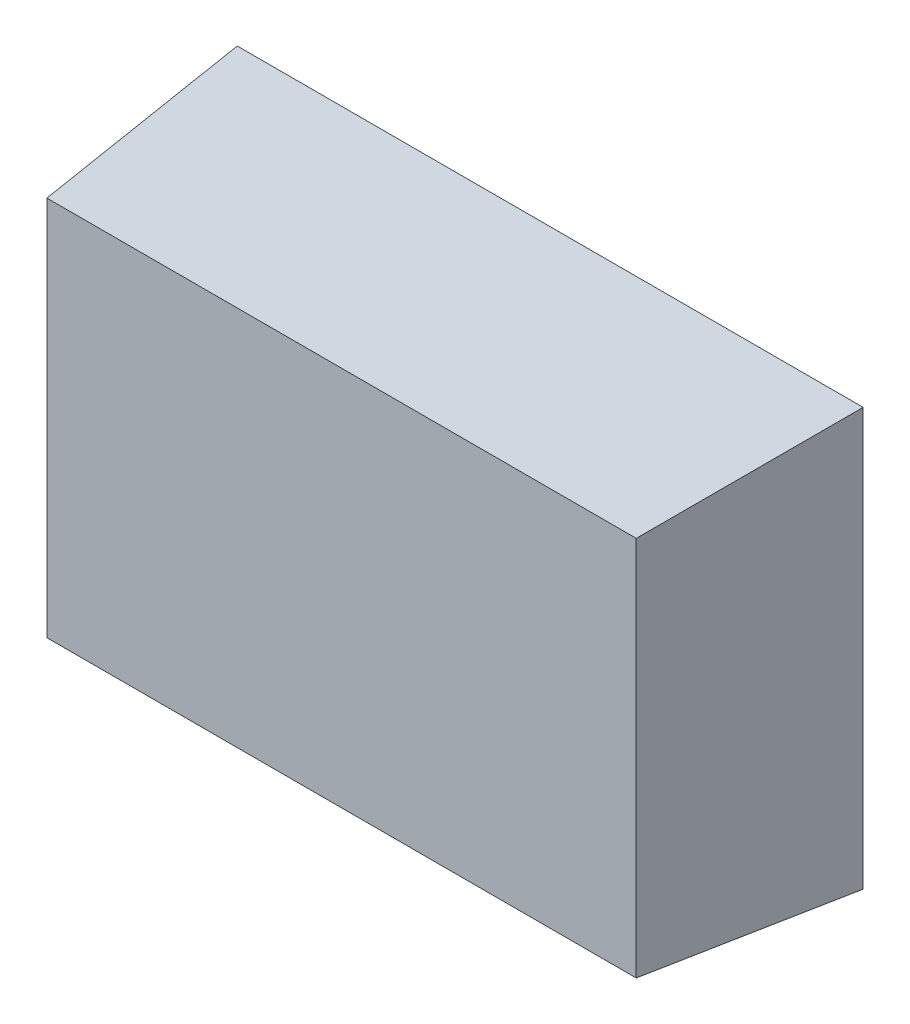
ISO-10303-21;
HEADER;
FILE_DESCRIPTION(('STEP AP214'),'2;1');
FILE_NAME('part.step','',(''),(''),'','','');
FILE_SCHEMA(('AUTOMOTIVE_DESIGN { 1 0 10303 214 1 1 1 1 }'));
ENDSEC;
DATA;
#1=APPLICATION_CONTEXT('core data for automotive mechanical design processes');
#2=APPLICATION_PROTOCOL_DEFINITION('international standard','automotive_design',2000,#1);
#3=PRODUCT_CONTEXT('',#1,'mechanical');
#4=PRODUCT('Part','Part','',(#3));
#5=PRODUCT_RELATED_PRODUCT_CATEGORY('part','',(#4));
#6=PRODUCT_DEFINITION_FORMATION('','',#4);
#7=PRODUCT_DEFINITION_CONTEXT('part definition',#1,'design');
#8=PRODUCT_DEFINITION('design','',#6,#7);
#9=PRODUCT_DEFINITION_SHAPE('','',#8);
#10=(LENGTH_UNIT() NAMED_UNIT(*) SI_UNIT(.MILLI.,.METRE.));
#11=(NAMED_UNIT(*) PLANE_ANGLE_UNIT() SI_UNIT($,.RADIAN.));
#12=(NAMED_UNIT(*) SI_UNIT($,.STERADIAN.) SOLID_ANGLE_UNIT());
#13=UNCERTAINTY_MEASURE_WITH_UNIT(LENGTH_MEASURE(1.E-05),#10,'distance_accuracy_value','');
#14=(GEOMETRIC_REPRESENTATION_CONTEXT(3) GLOBAL_UNCERTAINTY_ASSIGNED_CONTEXT((#13)) GLOBAL_UNIT_ASSIGNED_CONTEXT((#10,
#11,#12)) REPRESENTATION_CONTEXT('',''));
#15=CARTESIAN_POINT('',(0.,0.,0.));
#16=DIRECTION('',(0.,0.,1.));
#17=DIRECTION('',(1.,0.,0.));
#18=AXIS2_PLACEMENT_3D('',#15,#16,#17);
#19=CARTESIAN_POINT('',(0.6,0.4,0.205));
#20=DIRECTION('',(0.996194698091747,0.,0.0871557427476379));
#21=DIRECTION('',(0.,-1.,0.));
#22=AXIS2_PLACEMENT_3D('',#19,#20,#21);
#23=PLANE('',#22);
#24=DIRECTION('',(0.,1.,0.));
#25=VECTOR('',#24,1.);
#26=CARTESIAN_POINT('',(0.6,0.4,0.205));
#27=LINE('',#26,#25);
#28=CARTESIAN_POINT('',(0.6,-0.4,0.205));
#29=VERTEX_POINT('',#28);
#30=CARTESIAN_POINT('',(0.6,0.4,0.205));
#31=VERTEX_POINT('',#30);
#32=EDGE_CURVE('E11',#29,#31,#27,.T.);
#33=ORIENTED_EDGE('',*,*,#32,.T.);
#34=DIRECTION('',(0.0868265938642471,0.0868265938642471,-0.992432509138967));
#35=VECTOR('',#34,1.);
#36=CARTESIAN_POINT('',(0.590953371118,0.390953371118,0.30840344129));
#37=LINE('',#36,#35);
#38=CARTESIAN_POINT('',(0.56500453459,0.36500453459,0.605));
#39=VERTEX_POINT('',#38);
#40=EDGE_CURVE('E24',#39,#31,#37,.T.);
#41=ORIENTED_EDGE('',*,*,#40,.F.);
#42=DIRECTION('',(0.,1.,0.));
#43=VECTOR('',#42,1.);
#44=CARTESIAN_POINT('',(0.56500453459,0.4,0.605));
#45=LINE('',#44,#43);
#46=CARTESIAN_POINT('',(0.56500453459,-0.36500453459,0.605));
#47=VERTEX_POINT('',#46);
#48=EDGE_CURVE('E143',#47,#39,#45,.T.);
#49=ORIENTED_EDGE('',*,*,#48,.F.);
#50=DIRECTION('',(0.0868265938642471,-0.0868265938642471,-0.992432509138967));
#51=VECTOR('',#50,1.);
#52=CARTESIAN_POINT('',(0.593968914078,-0.393968914078,0.273935627527));
#53=LINE('',#52,#51);
#54=EDGE_CURVE('E141',#47,#29,#53,.T.);
#55=ORIENTED_EDGE('',*,*,#54,.T.);
#56=EDGE_LOOP('',(#33,#41,#49,#55));
#57=FACE_BOUND('',#56,.T.);
#58=ADVANCED_FACE('F17',(#57),#23,.T.);
#59=CARTESIAN_POINT('',(-0.6,0.4,0.205));
#60=DIRECTION('',(0.,0.996194698091747,0.0871557427476379));
#61=DIRECTION('',(1.,0.,0.));
#62=AXIS2_PLACEMENT_3D('',#59,#60,#61);
#63=PLANE('',#62);
#64=DIRECTION('',(-1.,0.,0.));
#65=VECTOR('',#64,1.);
#66=CARTESIAN_POINT('',(-0.6,0.4,0.205));
#67=LINE('',#66,#65);
#68=CARTESIAN_POINT('',(-0.6,0.4,0.205));
#69=VERTEX_POINT('',#68);
#70=EDGE_CURVE('E139',#31,#69,#67,.T.);
#71=ORIENTED_EDGE('',*,*,#70,.T.);
#72=DIRECTION('',(-0.0868265938642471,0.0868265938642471,-0.992432509138967));
#73=VECTOR('',#72,1.);
#74=CARTESIAN_POINT('',(-0.6,0.4,0.205));
#75=LINE('',#74,#73);
#76=CARTESIAN_POINT('',(-0.56500453459,0.36500453459,0.605));
#77=VERTEX_POINT('',#76);
#78=EDGE_CURVE('E136',#77,#69,#75,.T.);
#79=ORIENTED_EDGE('',*,*,#78,.F.);
#80=DIRECTION('',(-1.,0.,0.));
#81=VECTOR('',#80,1.);
#82=CARTESIAN_POINT('',(-0.6,0.36500453459,0.605));
#83=LINE('',#82,#81);
#84=EDGE_CURVE('E133',#39,#77,#83,.T.);
#85=ORIENTED_EDGE('',*,*,#84,.F.);
#86=ORIENTED_EDGE('',*,*,#40,.T.);
#87=EDGE_LOOP('',(#71,#79,#85,#86));
#88=FACE_BOUND('',#87,.T.);
#89=ADVANCED_FACE('F147',(#88),#63,.T.);
#90=CARTESIAN_POINT('',(-0.6,0.4,0.205));
#91=DIRECTION('',(-0.996194698091747,0.,0.0871557427476379));
#92=DIRECTION('',(0.,1.,0.));
#93=AXIS2_PLACEMENT_3D('',#90,#91,#92);
#94=PLANE('',#93);
#95=DIRECTION('',(0.,-1.,0.));
#96=VECTOR('',#95,1.);
#97=CARTESIAN_POINT('',(-0.6,0.4,0.205));
#98=LINE('',#97,#96);
#99=CARTESIAN_POINT('',(-0.6,-0.4,0.205));
#100=VERTEX_POINT('',#99);
#101=EDGE_CURVE('E131',#69,#100,#98,.T.);
#102=ORIENTED_EDGE('',*,*,#101,.T.);
#103=DIRECTION('',(-0.0868265938642471,-0.0868265938642471,-0.992432509138967));
#104=VECTOR('',#103,1.);
#105=CARTESIAN_POINT('',(-0.6,-0.4,0.205));
#106=LINE('',#105,#104);
#107=CARTESIAN_POINT('',(-0.56500453459,-0.36500453459,0.605));
#108=VERTEX_POINT('',#107);
#109=EDGE_CURVE('E128',#108,#100,#106,.T.);
#110=ORIENTED_EDGE('',*,*,#109,.F.);
#111=DIRECTION('',(0.,-1.,0.));
#112=VECTOR('',#111,1.);
#113=CARTESIAN_POINT('',(-0.56500453459,0.4,0.605));
#114=LINE('',#113,#112);
#115=EDGE_CURVE('E125',#77,#108,#114,.T.);
#116=ORIENTED_EDGE('',*,*,#115,.F.);
#117=ORIENTED_EDGE('',*,*,#78,.T.);
#118=EDGE_LOOP('',(#102,#110,#116,#117));
#119=FACE_BOUND('',#118,.T.);
#120=ADVANCED_FACE('F153',(#119),#94,.T.);
#121=CARTESIAN_POINT('',(-0.6,-0.4,0.205));
#122=DIRECTION('',(0.,-0.996194698091747,0.0871557427476379));
#123=DIRECTION('',(-1.,0.,0.));
#124=AXIS2_PLACEMENT_3D('',#121,#122,#123);
#125=PLANE('',#124);
#126=DIRECTION('',(1.,0.,0.));
#127=VECTOR('',#126,1.);
#128=CARTESIAN_POINT('',(-0.6,-0.4,0.205));
#129=LINE('',#128,#127);
#130=EDGE_CURVE('E122',#100,#29,#129,.T.);
#131=ORIENTED_EDGE('',*,*,#130,.T.);
#132=ORIENTED_EDGE('',*,*,#54,.F.);
#133=DIRECTION('',(1.,0.,0.));
#134=VECTOR('',#133,1.);
#135=CARTESIAN_POINT('',(-0.6,-0.36500453459,0.605));
#136=LINE('',#135,#134);
#137=EDGE_CURVE('E119',#108,#47,#136,.T.);
#138=ORIENTED_EDGE('',*,*,#137,.F.);
#139=ORIENTED_EDGE('',*,*,#109,.T.);
#140=EDGE_LOOP('',(#131,#132,#138,#139));
#141=FACE_BOUND('',#140,.T.);
#142=ADVANCED_FACE('F157',(#141),#125,.T.);
#143=CARTESIAN_POINT('',(0.,0.,0.605));
#144=DIRECTION('',(0.,0.,1.));
#145=DIRECTION('',(1.,0.,0.));
#146=AXIS2_PLACEMENT_3D('',#143,#144,#145);
#147=PLANE('',#146);
#148=ORIENTED_EDGE('',*,*,#48,.T.);
#149=ORIENTED_EDGE('',*,*,#84,.T.);
#150=ORIENTED_EDGE('',*,*,#115,.T.);
#151=ORIENTED_EDGE('',*,*,#137,.T.);
#152=EDGE_LOOP('',(#148,#149,#150,#151));
#153=FACE_BOUND('',#152,.T.);
#154=ADVANCED_FACE('F160',(#153),#147,.T.);
#155=CARTESIAN_POINT('',(0.,0.,0.205));
#156=DIRECTION('',(0.,0.,1.));
#157=DIRECTION('',(1.,0.,0.));
#158=AXIS2_PLACEMENT_3D('',#155,#156,#157);
#159=PLANE('',#158);
#160=DIRECTION('',(0.,-1.,0.));
#161=VECTOR('',#160,1.);
#162=CARTESIAN_POINT('',(0.45,0.25,0.205));
#163=LINE('',#162,#161);
#164=CARTESIAN_POINT('',(0.45,0.25,0.205));
#165=VERTEX_POINT('',#164);
#166=CARTESIAN_POINT('',(0.45,-0.25,0.205));
#167=VERTEX_POINT('',#166);
#168=EDGE_CURVE('E95',#165,#167,#163,.T.);
#169=ORIENTED_EDGE('',*,*,#168,.F.);
#170=DIRECTION('',(1.,0.,0.));
#171=VECTOR('',#170,1.);
#172=CARTESIAN_POINT('',(-0.45,0.25,0.205));
#173=LINE('',#172,#171);
#174=CARTESIAN_POINT('',(-0.45,0.25,0.205));
#175=VERTEX_POINT('',#174);
#176=EDGE_CURVE('E115',#175,#165,#173,.T.);
#177=ORIENTED_EDGE('',*,*,#176,.F.);
#178=DIRECTION('',(0.,1.,0.));
#179=VECTOR('',#178,1.);
#180=CARTESIAN_POINT('',(-0.45,-0.25,0.205));
#181=LINE('',#180,#179);
#182=CARTESIAN_POINT('',(-0.45,-0.25,0.205));
#183=VERTEX_POINT('',#182);
#184=EDGE_CURVE('E112',#183,#175,#181,.T.);
#185=ORIENTED_EDGE('',*,*,#184,.F.);
#186=DIRECTION('',(-1.,0.,0.));
#187=VECTOR('',#186,1.);
#188=CARTESIAN_POINT('',(0.45,-0.25,0.205));
#189=LINE('',#188,#187);
#190=EDGE_CURVE('E110',#167,#183,#189,.T.);
#191=ORIENTED_EDGE('',*,*,#190,.F.);
#192=EDGE_LOOP('',(#169,#177,#185,#191));
#193=FACE_BOUND('',#192,.T.);
#194=ORIENTED_EDGE('',*,*,#32,.F.);
#195=ORIENTED_EDGE('',*,*,#130,.F.);
#196=ORIENTED_EDGE('',*,*,#101,.F.);
#197=ORIENTED_EDGE('',*,*,#70,.F.);
#198=EDGE_LOOP('',(#194,#195,#196,#197));
#199=FACE_BOUND('',#198,.T.);
#200=ADVANCED_FACE('F150',(#193,#199),#159,.F.);
#201=CARTESIAN_POINT('',(-0.45,0.25,0.505));
#202=DIRECTION('',(0.,1.,0.));
#203=DIRECTION('',(1.,0.,0.));
#204=AXIS2_PLACEMENT_3D('',#201,#202,#203);
#205=PLANE('',#204);
#206=ORIENTED_EDGE('',*,*,#176,.T.);
#207=DIRECTION('',(0.,0.,-1.));
#208=VECTOR('',#207,1.);
#209=CARTESIAN_POINT('',(0.45,0.25,0.505));
#210=LINE('',#209,#208);
#211=CARTESIAN_POINT('',(0.45,0.25,0.505));
#212=VERTEX_POINT('',#211);
#213=EDGE_CURVE('E108',#212,#165,#210,.T.);
#214=ORIENTED_EDGE('',*,*,#213,.F.);
#215=DIRECTION('',(1.,0.,0.));
#216=VECTOR('',#215,1.);
#217=CARTESIAN_POINT('',(-0.45,0.25,0.505));
#218=LINE('',#217,#216);
#219=CARTESIAN_POINT('',(-0.45,0.25,0.505));
#220=VERTEX_POINT('',#219);
#221=EDGE_CURVE('E98',#220,#212,#218,.T.);
#222=ORIENTED_EDGE('',*,*,#221,.F.);
#223=DIRECTION('',(0.,0.,-1.));
#224=VECTOR('',#223,1.);
#225=CARTESIAN_POINT('',(-0.45,0.25,0.505));
#226=LINE('',#225,#224);
#227=EDGE_CURVE('E104',#220,#175,#226,.T.);
#228=ORIENTED_EDGE('',*,*,#227,.T.);
#229=EDGE_LOOP('',(#206,#214,#222,#228));
#230=FACE_BOUND('',#229,.T.);
#231=ADVANCED_FACE('F177',(#230),#205,.F.);
#232=CARTESIAN_POINT('',(-0.45,-0.25,0.505));
#233=DIRECTION('',(-1.,0.,0.));
#234=DIRECTION('',(0.,1.,0.));
#235=AXIS2_PLACEMENT_3D('',#232,#233,#234);
#236=PLANE('',#235);
#237=ORIENTED_EDGE('',*,*,#184,.T.);
#238=ORIENTED_EDGE('',*,*,#227,.F.);
#239=DIRECTION('',(0.,1.,0.));
#240=VECTOR('',#239,1.);
#241=CARTESIAN_POINT('',(-0.45,-0.25,0.505));
#242=LINE('',#241,#240);
#243=CARTESIAN_POINT('',(-0.45,-0.25,0.505));
#244=VERTEX_POINT('',#243);
#245=EDGE_CURVE('E102',#244,#220,#242,.T.);
#246=ORIENTED_EDGE('',*,*,#245,.F.);
#247=DIRECTION('',(0.,0.,-1.));
#248=VECTOR('',#247,1.);
#249=CARTESIAN_POINT('',(-0.45,-0.25,0.505));
#250=LINE('',#249,#248);
#251=EDGE_CURVE('E84',#244,#183,#250,.T.);
#252=ORIENTED_EDGE('',*,*,#251,.T.);
#253=EDGE_LOOP('',(#237,#238,#246,#252));
#254=FACE_BOUND('',#253,.T.);
#255=ADVANCED_FACE('F181',(#254),#236,.F.);
#256=CARTESIAN_POINT('',(0.45,-0.25,0.505));
#257=DIRECTION('',(0.,-1.,0.));
#258=DIRECTION('',(0.,0.,-1.));
#259=AXIS2_PLACEMENT_3D('',#256,#257,#258);
#260=PLANE('',#259);
#261=ORIENTED_EDGE('',*,*,#190,.T.);
#262=ORIENTED_EDGE('',*,*,#251,.F.);
#263=DIRECTION('',(-1.,0.,0.));
#264=VECTOR('',#263,1.);
#265=CARTESIAN_POINT('',(0.45,-0.25,0.505));
#266=LINE('',#265,#264);
#267=CARTESIAN_POINT('',(0.45,-0.25,0.505));
#268=VERTEX_POINT('',#267);
#269=EDGE_CURVE('E77',#268,#244,#266,.T.);
#270=ORIENTED_EDGE('',*,*,#269,.F.);
#271=DIRECTION('',(0.,0.,-1.));
#272=VECTOR('',#271,1.);
#273=CARTESIAN_POINT('',(0.45,-0.25,0.505));
#274=LINE('',#273,#272);
#275=EDGE_CURVE('E81',#268,#167,#274,.T.);
#276=ORIENTED_EDGE('',*,*,#275,.T.);
#277=EDGE_LOOP('',(#261,#262,#270,#276));
#278=FACE_BOUND('',#277,.T.);
#279=ADVANCED_FACE('F80',(#278),#260,.F.);
#280=CARTESIAN_POINT('',(0.45,0.25,0.505));
#281=DIRECTION('',(1.,0.,0.));
#282=DIRECTION('',(0.,1.,0.));
#283=AXIS2_PLACEMENT_3D('',#280,#281,#282);
#284=PLANE('',#283);
#285=ORIENTED_EDGE('',*,*,#168,.T.);
#286=ORIENTED_EDGE('',*,*,#275,.F.);
#287=DIRECTION('',(0.,-1.,0.));
#288=VECTOR('',#287,1.);
#289=CARTESIAN_POINT('',(0.45,0.25,0.505));
#290=LINE('',#289,#288);
#291=EDGE_CURVE('E93',#212,#268,#290,.T.);
#292=ORIENTED_EDGE('',*,*,#291,.F.);
#293=ORIENTED_EDGE('',*,*,#213,.T.);
#294=EDGE_LOOP('',(#285,#286,#292,#293));
#295=FACE_BOUND('',#294,.T.);
#296=ADVANCED_FACE('F91',(#295),#284,.F.);
#297=CARTESIAN_POINT('',(0.,0.,0.505));
#298=DIRECTION('',(0.,0.,-1.));
#299=DIRECTION('',(0.,-1.,0.));
#300=AXIS2_PLACEMENT_3D('',#297,#298,#299);
#301=PLANE('',#300);
#302=ORIENTED_EDGE('',*,*,#221,.T.);
#303=ORIENTED_EDGE('',*,*,#291,.T.);
#304=ORIENTED_EDGE('',*,*,#269,.T.);
#305=ORIENTED_EDGE('',*,*,#245,.T.);
#306=EDGE_LOOP('',(#302,#303,#304,#305));
#307=FACE_BOUND('',#306,.T.);
#308=ADVANCED_FACE('F97',(#307),#301,.T.);
#309=CLOSED_SHELL('',(#58,#89,#120,#142,#154,#200,#231,#255,#279,#296,#308));
#310=MANIFOLD_SOLID_BREP('B1',#309);
#311=ADVANCED_BREP_SHAPE_REPRESENTATION('',(#18,#310),#14);
#312=SHAPE_DEFINITION_REPRESENTATION(#9,#311);
ENDSEC;
END-ISO-10303-21;
